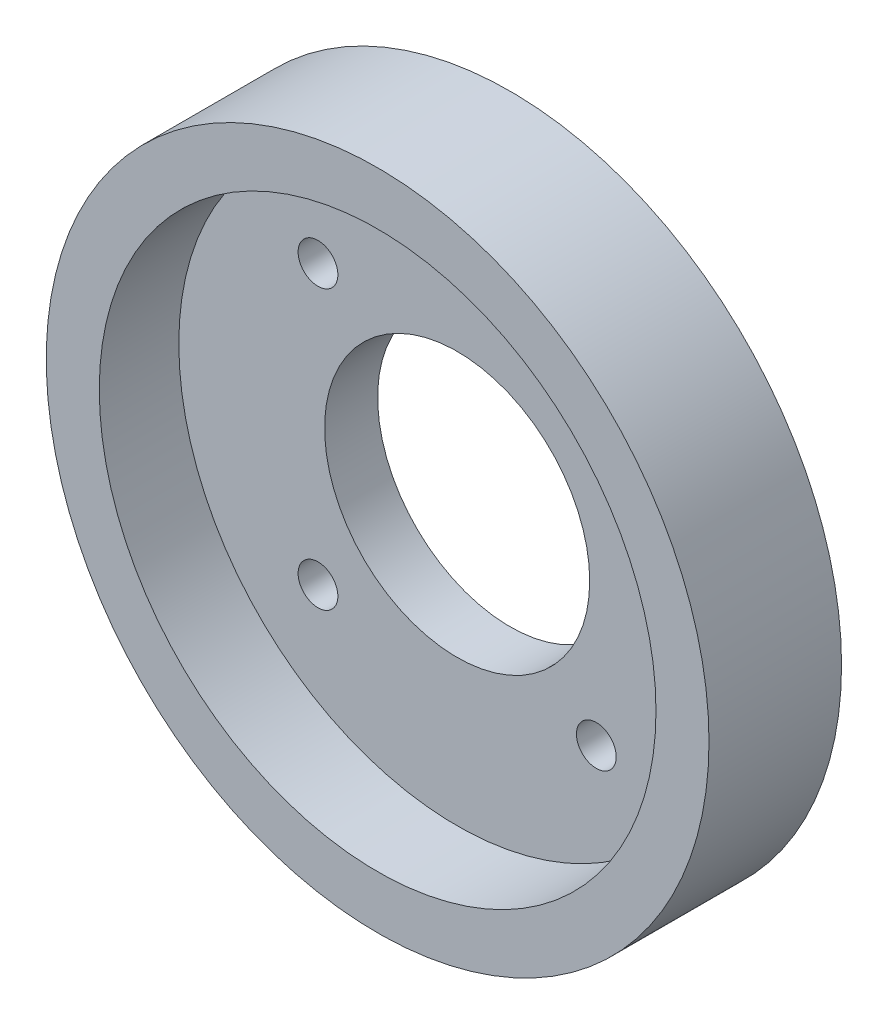
ISO-10303-21;
HEADER;
FILE_DESCRIPTION(('STEP AP214'),'2;1');
FILE_NAME('part.step','',(''),(''),'','','');
FILE_SCHEMA(('AUTOMOTIVE_DESIGN { 1 0 10303 214 1 1 1 1 }'));
ENDSEC;
DATA;
#1=APPLICATION_CONTEXT('core data for automotive mechanical design processes');
#2=APPLICATION_PROTOCOL_DEFINITION('international standard','automotive_design',2000,#1);
#3=PRODUCT_CONTEXT('',#1,'mechanical');
#4=PRODUCT('Part','Part','',(#3));
#5=PRODUCT_RELATED_PRODUCT_CATEGORY('part','',(#4));
#6=PRODUCT_DEFINITION_FORMATION('','',#4);
#7=PRODUCT_DEFINITION_CONTEXT('part definition',#1,'design');
#8=PRODUCT_DEFINITION('design','',#6,#7);
#9=PRODUCT_DEFINITION_SHAPE('','',#8);
#10=(LENGTH_UNIT() NAMED_UNIT(*) SI_UNIT(.MILLI.,.METRE.));
#11=(NAMED_UNIT(*) PLANE_ANGLE_UNIT() SI_UNIT($,.RADIAN.));
#12=(NAMED_UNIT(*) SI_UNIT($,.STERADIAN.) SOLID_ANGLE_UNIT());
#13=UNCERTAINTY_MEASURE_WITH_UNIT(LENGTH_MEASURE(1.E-05),#10,'distance_accuracy_value','');
#14=(GEOMETRIC_REPRESENTATION_CONTEXT(3) GLOBAL_UNCERTAINTY_ASSIGNED_CONTEXT((#13)) GLOBAL_UNIT_ASSIGNED_CONTEXT((#10,
#11,#12)) REPRESENTATION_CONTEXT('',''));
#15=CARTESIAN_POINT('',(0.,0.,0.));
#16=DIRECTION('',(0.,0.,1.));
#17=DIRECTION('',(1.,0.,0.));
#18=AXIS2_PLACEMENT_3D('',#15,#16,#17);
#19=CARTESIAN_POINT('',(0.,0.,2.));
#20=DIRECTION('',(0.,0.,1.));
#21=DIRECTION('',(1.,0.,0.));
#22=AXIS2_PLACEMENT_3D('',#19,#20,#21);
#23=PLANE('',#22);
#24=CARTESIAN_POINT('',(0.,0.,2.));
#25=DIRECTION('',(0.,0.,1.));
#26=DIRECTION('',(1.,0.,0.));
#27=AXIS2_PLACEMENT_3D('',#24,#25,#26);
#28=CIRCLE('',#27,5.);
#29=CARTESIAN_POINT('',(5.,0.,2.));
#30=VERTEX_POINT('',#29);
#31=EDGE_CURVE('E10',#30,#30,#28,.T.);
#32=ORIENTED_EDGE('',*,*,#31,.F.);
#33=EDGE_LOOP('',(#32));
#34=FACE_BOUND('',#33,.T.);
#35=CARTESIAN_POINT('',(-5.25,5.25,2.));
#36=DIRECTION('',(0.,0.,1.));
#37=DIRECTION('',(1.,0.,0.));
#38=AXIS2_PLACEMENT_3D('',#35,#36,#37);
#39=CIRCLE('',#38,0.75);
#40=CARTESIAN_POINT('',(-4.5,5.25,2.));
#41=VERTEX_POINT('',#40);
#42=EDGE_CURVE('E52',#41,#41,#39,.T.);
#43=ORIENTED_EDGE('',*,*,#42,.F.);
#44=EDGE_LOOP('',(#43));
#45=FACE_BOUND('',#44,.T.);
#46=CARTESIAN_POINT('',(5.25,5.25,2.));
#47=DIRECTION('',(0.,0.,1.));
#48=DIRECTION('',(1.,0.,0.));
#49=AXIS2_PLACEMENT_3D('',#46,#47,#48);
#50=CIRCLE('',#49,0.75);
#51=CARTESIAN_POINT('',(6.,5.25,2.));
#52=VERTEX_POINT('',#51);
#53=EDGE_CURVE('E58',#52,#52,#50,.T.);
#54=ORIENTED_EDGE('',*,*,#53,.F.);
#55=EDGE_LOOP('',(#54));
#56=FACE_BOUND('',#55,.T.);
#57=CARTESIAN_POINT('',(5.25,-5.25,2.));
#58=DIRECTION('',(0.,0.,1.));
#59=DIRECTION('',(1.,0.,0.));
#60=AXIS2_PLACEMENT_3D('',#57,#58,#59);
#61=CIRCLE('',#60,0.75);
#62=CARTESIAN_POINT('',(6.,-5.25,2.));
#63=VERTEX_POINT('',#62);
#64=EDGE_CURVE('E90',#63,#63,#61,.T.);
#65=ORIENTED_EDGE('',*,*,#64,.F.);
#66=EDGE_LOOP('',(#65));
#67=FACE_BOUND('',#66,.T.);
#68=CARTESIAN_POINT('',(-5.25,-5.25,2.));
#69=DIRECTION('',(0.,0.,1.));
#70=DIRECTION('',(1.,0.,0.));
#71=AXIS2_PLACEMENT_3D('',#68,#69,#70);
#72=CIRCLE('',#71,0.75);
#73=CARTESIAN_POINT('',(-4.5,-5.25,2.));
#74=VERTEX_POINT('',#73);
#75=EDGE_CURVE('E85',#74,#74,#72,.T.);
#76=ORIENTED_EDGE('',*,*,#75,.F.);
#77=EDGE_LOOP('',(#76));
#78=FACE_BOUND('',#77,.T.);
#79=CARTESIAN_POINT('',(0.,0.,2.));
#80=DIRECTION('',(0.,0.,1.));
#81=DIRECTION('',(1.,0.,0.));
#82=AXIS2_PLACEMENT_3D('',#79,#80,#81);
#83=CIRCLE('',#82,10.5);
#84=CARTESIAN_POINT('',(10.5,0.,2.));
#85=VERTEX_POINT('',#84);
#86=EDGE_CURVE('E98',#85,#85,#83,.T.);
#87=ORIENTED_EDGE('',*,*,#86,.T.);
#88=EDGE_LOOP('',(#87));
#89=FACE_BOUND('',#88,.T.);
#90=ADVANCED_FACE('F43',(#34,#45,#56,#67,#78,#89),#23,.T.);
#91=CARTESIAN_POINT('',(0.,0.,2.));
#92=DIRECTION('',(0.,0.,-1.));
#93=DIRECTION('',(-1.,0.,0.));
#94=AXIS2_PLACEMENT_3D('',#91,#92,#93);
#95=CYLINDRICAL_SURFACE('',#94,5.);
#96=ORIENTED_EDGE('',*,*,#31,.T.);
#97=EDGE_LOOP('',(#96));
#98=FACE_BOUND('',#97,.T.);
#99=CARTESIAN_POINT('',(0.,0.,0.));
#100=DIRECTION('',(0.,0.,1.));
#101=DIRECTION('',(1.,0.,0.));
#102=AXIS2_PLACEMENT_3D('',#99,#100,#101);
#103=CIRCLE('',#102,5.);
#104=CARTESIAN_POINT('',(5.,0.,0.));
#105=VERTEX_POINT('',#104);
#106=EDGE_CURVE('E78',#105,#105,#103,.T.);
#107=ORIENTED_EDGE('',*,*,#106,.F.);
#108=EDGE_LOOP('',(#107));
#109=FACE_BOUND('',#108,.T.);
#110=ADVANCED_FACE('F109',(#98,#109),#95,.F.);
#111=CARTESIAN_POINT('',(-5.25,5.25,2.));
#112=DIRECTION('',(0.,0.,-1.));
#113=DIRECTION('',(-1.,0.,0.));
#114=AXIS2_PLACEMENT_3D('',#111,#112,#113);
#115=CYLINDRICAL_SURFACE('',#114,0.75);
#116=ORIENTED_EDGE('',*,*,#42,.T.);
#117=EDGE_LOOP('',(#116));
#118=FACE_BOUND('',#117,.T.);
#119=CARTESIAN_POINT('',(-5.25,5.25,0.));
#120=DIRECTION('',(0.,0.,1.));
#121=DIRECTION('',(1.,0.,0.));
#122=AXIS2_PLACEMENT_3D('',#119,#120,#121);
#123=CIRCLE('',#122,0.75);
#124=CARTESIAN_POINT('',(-4.5,5.25,0.));
#125=VERTEX_POINT('',#124);
#126=EDGE_CURVE('E75',#125,#125,#123,.T.);
#127=ORIENTED_EDGE('',*,*,#126,.F.);
#128=EDGE_LOOP('',(#127));
#129=FACE_BOUND('',#128,.T.);
#130=ADVANCED_FACE('F146',(#118,#129),#115,.F.);
#131=CARTESIAN_POINT('',(5.25,5.25,2.));
#132=DIRECTION('',(0.,0.,-1.));
#133=DIRECTION('',(-1.,0.,0.));
#134=AXIS2_PLACEMENT_3D('',#131,#132,#133);
#135=CYLINDRICAL_SURFACE('',#134,0.75);
#136=ORIENTED_EDGE('',*,*,#53,.T.);
#137=EDGE_LOOP('',(#136));
#138=FACE_BOUND('',#137,.T.);
#139=CARTESIAN_POINT('',(5.25,5.25,0.));
#140=DIRECTION('',(0.,0.,1.));
#141=DIRECTION('',(1.,0.,0.));
#142=AXIS2_PLACEMENT_3D('',#139,#140,#141);
#143=CIRCLE('',#142,0.75);
#144=CARTESIAN_POINT('',(6.,5.25,0.));
#145=VERTEX_POINT('',#144);
#146=EDGE_CURVE('E71',#145,#145,#143,.T.);
#147=ORIENTED_EDGE('',*,*,#146,.F.);
#148=EDGE_LOOP('',(#147));
#149=FACE_BOUND('',#148,.T.);
#150=ADVANCED_FACE('F104',(#138,#149),#135,.F.);
#151=CARTESIAN_POINT('',(5.25,-5.25,2.));
#152=DIRECTION('',(0.,0.,-1.));
#153=DIRECTION('',(-1.,0.,0.));
#154=AXIS2_PLACEMENT_3D('',#151,#152,#153);
#155=CYLINDRICAL_SURFACE('',#154,0.75);
#156=ORIENTED_EDGE('',*,*,#64,.T.);
#157=EDGE_LOOP('',(#156));
#158=FACE_BOUND('',#157,.T.);
#159=CARTESIAN_POINT('',(5.25,-5.25,0.));
#160=DIRECTION('',(0.,0.,1.));
#161=DIRECTION('',(1.,0.,0.));
#162=AXIS2_PLACEMENT_3D('',#159,#160,#161);
#163=CIRCLE('',#162,0.75);
#164=CARTESIAN_POINT('',(6.,-5.25,0.));
#165=VERTEX_POINT('',#164);
#166=EDGE_CURVE('E66',#165,#165,#163,.T.);
#167=ORIENTED_EDGE('',*,*,#166,.F.);
#168=EDGE_LOOP('',(#167));
#169=FACE_BOUND('',#168,.T.);
#170=ADVANCED_FACE('F142',(#158,#169),#155,.F.);
#171=CARTESIAN_POINT('',(-5.25,-5.25,2.));
#172=DIRECTION('',(0.,0.,-1.));
#173=DIRECTION('',(-1.,0.,0.));
#174=AXIS2_PLACEMENT_3D('',#171,#172,#173);
#175=CYLINDRICAL_SURFACE('',#174,0.75);
#176=ORIENTED_EDGE('',*,*,#75,.T.);
#177=EDGE_LOOP('',(#176));
#178=FACE_BOUND('',#177,.T.);
#179=CARTESIAN_POINT('',(-5.25,-5.25,0.));
#180=DIRECTION('',(0.,0.,1.));
#181=DIRECTION('',(1.,0.,0.));
#182=AXIS2_PLACEMENT_3D('',#179,#180,#181);
#183=CIRCLE('',#182,0.75);
#184=CARTESIAN_POINT('',(-4.5,-5.25,0.));
#185=VERTEX_POINT('',#184);
#186=EDGE_CURVE('E62',#185,#185,#183,.T.);
#187=ORIENTED_EDGE('',*,*,#186,.F.);
#188=EDGE_LOOP('',(#187));
#189=FACE_BOUND('',#188,.T.);
#190=ADVANCED_FACE('F45',(#178,#189),#175,.F.);
#191=CARTESIAN_POINT('',(0.,0.,2.));
#192=DIRECTION('',(0.,0.,-1.));
#193=DIRECTION('',(-1.,0.,0.));
#194=AXIS2_PLACEMENT_3D('',#191,#192,#193);
#195=CYLINDRICAL_SURFACE('',#194,12.5);
#196=CARTESIAN_POINT('',(0.,0.,0.));
#197=DIRECTION('',(0.,0.,1.));
#198=DIRECTION('',(1.,0.,0.));
#199=AXIS2_PLACEMENT_3D('',#196,#197,#198);
#200=CIRCLE('',#199,12.5);
#201=CARTESIAN_POINT('',(12.5,0.,0.));
#202=VERTEX_POINT('',#201);
#203=EDGE_CURVE('E47',#202,#202,#200,.T.);
#204=ORIENTED_EDGE('',*,*,#203,.T.);
#205=EDGE_LOOP('',(#204));
#206=FACE_BOUND('',#205,.T.);
#207=CARTESIAN_POINT('',(0.,0.,5.));
#208=DIRECTION('',(0.,0.,1.));
#209=DIRECTION('',(1.,0.,0.));
#210=AXIS2_PLACEMENT_3D('',#207,#208,#209);
#211=CIRCLE('',#210,12.5);
#212=CARTESIAN_POINT('',(12.5,0.,5.));
#213=VERTEX_POINT('',#212);
#214=EDGE_CURVE('E67',#213,#213,#211,.T.);
#215=ORIENTED_EDGE('',*,*,#214,.F.);
#216=EDGE_LOOP('',(#215));
#217=FACE_BOUND('',#216,.T.);
#218=ADVANCED_FACE('F131',(#206,#217),#195,.T.);
#219=CARTESIAN_POINT('',(0.,0.,0.));
#220=DIRECTION('',(0.,0.,1.));
#221=DIRECTION('',(1.,0.,0.));
#222=AXIS2_PLACEMENT_3D('',#219,#220,#221);
#223=PLANE('',#222);
#224=ORIENTED_EDGE('',*,*,#186,.T.);
#225=EDGE_LOOP('',(#224));
#226=FACE_BOUND('',#225,.T.);
#227=ORIENTED_EDGE('',*,*,#166,.T.);
#228=EDGE_LOOP('',(#227));
#229=FACE_BOUND('',#228,.T.);
#230=ORIENTED_EDGE('',*,*,#146,.T.);
#231=EDGE_LOOP('',(#230));
#232=FACE_BOUND('',#231,.T.);
#233=ORIENTED_EDGE('',*,*,#126,.T.);
#234=EDGE_LOOP('',(#233));
#235=FACE_BOUND('',#234,.T.);
#236=ORIENTED_EDGE('',*,*,#106,.T.);
#237=EDGE_LOOP('',(#236));
#238=FACE_BOUND('',#237,.T.);
#239=ORIENTED_EDGE('',*,*,#203,.F.);
#240=EDGE_LOOP('',(#239));
#241=FACE_BOUND('',#240,.T.);
#242=ADVANCED_FACE('F133',(#226,#229,#232,#235,#238,#241),#223,.F.);
#243=CARTESIAN_POINT('',(0.,0.,5.));
#244=DIRECTION('',(0.,0.,-1.));
#245=DIRECTION('',(-1.,0.,0.));
#246=AXIS2_PLACEMENT_3D('',#243,#244,#245);
#247=CYLINDRICAL_SURFACE('',#246,10.5);
#248=CARTESIAN_POINT('',(0.,0.,5.));
#249=DIRECTION('',(0.,0.,1.));
#250=DIRECTION('',(1.,0.,0.));
#251=AXIS2_PLACEMENT_3D('',#248,#249,#250);
#252=CIRCLE('',#251,10.5);
#253=CARTESIAN_POINT('',(10.5,0.,5.));
#254=VERTEX_POINT('',#253);
#255=EDGE_CURVE('E119',#254,#254,#252,.T.);
#256=ORIENTED_EDGE('',*,*,#255,.T.);
#257=EDGE_LOOP('',(#256));
#258=FACE_BOUND('',#257,.T.);
#259=ORIENTED_EDGE('',*,*,#86,.F.);
#260=EDGE_LOOP('',(#259));
#261=FACE_BOUND('',#260,.T.);
#262=ADVANCED_FACE('F139',(#258,#261),#247,.F.);
#263=CARTESIAN_POINT('',(0.,0.,5.));
#264=DIRECTION('',(0.,0.,1.));
#265=DIRECTION('',(1.,0.,0.));
#266=AXIS2_PLACEMENT_3D('',#263,#264,#265);
#267=PLANE('',#266);
#268=ORIENTED_EDGE('',*,*,#255,.F.);
#269=EDGE_LOOP('',(#268));
#270=FACE_BOUND('',#269,.T.);
#271=ORIENTED_EDGE('',*,*,#214,.T.);
#272=EDGE_LOOP('',(#271));
#273=FACE_BOUND('',#272,.T.);
#274=ADVANCED_FACE('F129',(#270,#273),#267,.T.);
#275=CLOSED_SHELL('',(#90,#110,#130,#150,#170,#190,#218,#242,#262,#274));
#276=MANIFOLD_SOLID_BREP('B2',#275);
#277=ADVANCED_BREP_SHAPE_REPRESENTATION('',(#18,#276),#14);
#278=SHAPE_DEFINITION_REPRESENTATION(#9,#277);
ENDSEC;
END-ISO-10303-21;
